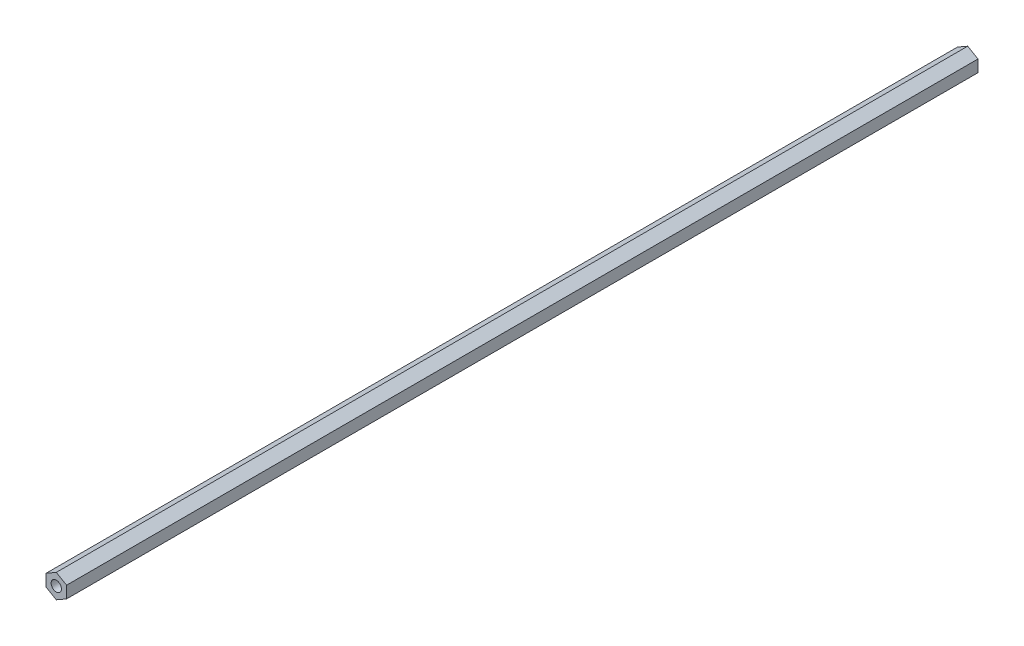
ISO-10303-21;
HEADER;
FILE_DESCRIPTION(('STEP AP214'),'2;1');
FILE_NAME('part.step','',(''),(''),'','','');
FILE_SCHEMA(('AUTOMOTIVE_DESIGN { 1 0 10303 214 1 1 1 1 }'));
ENDSEC;
DATA;
#1=APPLICATION_CONTEXT('core data for automotive mechanical design processes');
#2=APPLICATION_PROTOCOL_DEFINITION('international standard','automotive_design',2000,#1);
#3=PRODUCT_CONTEXT('',#1,'mechanical');
#4=PRODUCT('Part','Part','',(#3));
#5=PRODUCT_RELATED_PRODUCT_CATEGORY('part','',(#4));
#6=PRODUCT_DEFINITION_FORMATION('','',#4);
#7=PRODUCT_DEFINITION_CONTEXT('part definition',#1,'design');
#8=PRODUCT_DEFINITION('design','',#6,#7);
#9=PRODUCT_DEFINITION_SHAPE('','',#8);
#10=(LENGTH_UNIT() NAMED_UNIT(*) SI_UNIT(.MILLI.,.METRE.));
#11=(NAMED_UNIT(*) PLANE_ANGLE_UNIT() SI_UNIT($,.RADIAN.));
#12=(NAMED_UNIT(*) SI_UNIT($,.STERADIAN.) SOLID_ANGLE_UNIT());
#13=UNCERTAINTY_MEASURE_WITH_UNIT(LENGTH_MEASURE(1.E-05),#10,'distance_accuracy_value','');
#14=(GEOMETRIC_REPRESENTATION_CONTEXT(3) GLOBAL_UNCERTAINTY_ASSIGNED_CONTEXT((#13)) GLOBAL_UNIT_ASSIGNED_CONTEXT((#10,
#11,#12)) REPRESENTATION_CONTEXT('',''));
#15=CARTESIAN_POINT('',(0.,0.,0.));
#16=DIRECTION('',(0.,0.,1.));
#17=DIRECTION('',(1.,0.,0.));
#18=AXIS2_PLACEMENT_3D('',#15,#16,#17);
#19=CARTESIAN_POINT('',(-6.35,3.66617420935411,280.9875));
#20=DIRECTION('',(1.,0.,0.));
#21=DIRECTION('',(0.,0.,-1.));
#22=AXIS2_PLACEMENT_3D('',#19,#20,#21);
#23=PLANE('',#22);
#24=DIRECTION('',(0.,0.,-1.));
#25=VECTOR('',#24,1.);
#26=CARTESIAN_POINT('',(-6.35,3.66617420935411,280.9875));
#27=LINE('',#26,#25);
#28=CARTESIAN_POINT('',(-6.35,3.66617420935411,280.9875));
#29=VERTEX_POINT('',#28);
#30=CARTESIAN_POINT('',(-6.35,3.66617420935411,-280.9875));
#31=VERTEX_POINT('',#30);
#32=EDGE_CURVE('E141',#29,#31,#27,.T.);
#33=ORIENTED_EDGE('',*,*,#32,.T.);
#34=DIRECTION('',(0.,-1.,0.));
#35=VECTOR('',#34,1.);
#36=CARTESIAN_POINT('',(-6.35,3.66617420935411,-280.9875));
#37=LINE('',#36,#35);
#38=CARTESIAN_POINT('',(-6.35,-3.66617420935413,-280.9875));
#39=VERTEX_POINT('',#38);
#40=EDGE_CURVE('E113',#31,#39,#37,.T.);
#41=ORIENTED_EDGE('',*,*,#40,.T.);
#42=DIRECTION('',(0.,0.,-1.));
#43=VECTOR('',#42,1.);
#44=CARTESIAN_POINT('',(-6.35,-3.66617420935413,280.9875));
#45=LINE('',#44,#43);
#46=CARTESIAN_POINT('',(-6.35,-3.66617420935413,280.9875));
#47=VERTEX_POINT('',#46);
#48=EDGE_CURVE('E11',#47,#39,#45,.T.);
#49=ORIENTED_EDGE('',*,*,#48,.F.);
#50=DIRECTION('',(0.,-1.,0.));
#51=VECTOR('',#50,1.);
#52=CARTESIAN_POINT('',(-6.35,3.66617420935411,280.9875));
#53=LINE('',#52,#51);
#54=EDGE_CURVE('E131',#29,#47,#53,.T.);
#55=ORIENTED_EDGE('',*,*,#54,.F.);
#56=EDGE_LOOP('',(#33,#41,#49,#55));
#57=FACE_BOUND('',#56,.T.);
#58=ADVANCED_FACE('F37',(#57),#23,.F.);
#59=CARTESIAN_POINT('',(-6.35,-3.66617420935413,280.9875));
#60=DIRECTION('',(0.5,0.866025403784439,0.));
#61=DIRECTION('',(-0.866025403784439,0.5,0.));
#62=AXIS2_PLACEMENT_3D('',#59,#60,#61);
#63=PLANE('',#62);
#64=ORIENTED_EDGE('',*,*,#48,.T.);
#65=DIRECTION('',(0.866025403784439,-0.5,0.));
#66=VECTOR('',#65,1.);
#67=CARTESIAN_POINT('',(-6.35,-3.66617420935413,-280.9875));
#68=LINE('',#67,#66);
#69=CARTESIAN_POINT('',(0.,-7.33234841870826,-280.9875));
#70=VERTEX_POINT('',#69);
#71=EDGE_CURVE('E116',#39,#70,#68,.T.);
#72=ORIENTED_EDGE('',*,*,#71,.T.);
#73=DIRECTION('',(0.,0.,-1.));
#74=VECTOR('',#73,1.);
#75=CARTESIAN_POINT('',(0.,-7.33234841870826,280.9875));
#76=LINE('',#75,#74);
#77=CARTESIAN_POINT('',(0.,-7.33234841870826,280.9875));
#78=VERTEX_POINT('',#77);
#79=EDGE_CURVE('E44',#78,#70,#76,.T.);
#80=ORIENTED_EDGE('',*,*,#79,.F.);
#81=DIRECTION('',(0.866025403784439,-0.5,0.));
#82=VECTOR('',#81,1.);
#83=CARTESIAN_POINT('',(-6.35,-3.66617420935413,280.9875));
#84=LINE('',#83,#82);
#85=EDGE_CURVE('E133',#47,#78,#84,.T.);
#86=ORIENTED_EDGE('',*,*,#85,.F.);
#87=EDGE_LOOP('',(#64,#72,#80,#86));
#88=FACE_BOUND('',#87,.T.);
#89=ADVANCED_FACE('F161',(#88),#63,.F.);
#90=CARTESIAN_POINT('',(0.,-7.33234841870826,280.9875));
#91=DIRECTION('',(-0.5,0.866025403784439,0.));
#92=DIRECTION('',(-0.866025403784439,-0.5,0.));
#93=AXIS2_PLACEMENT_3D('',#90,#91,#92);
#94=PLANE('',#93);
#95=ORIENTED_EDGE('',*,*,#79,.T.);
#96=DIRECTION('',(0.866025403784439,0.5,0.));
#97=VECTOR('',#96,1.);
#98=CARTESIAN_POINT('',(0.,-7.33234841870826,-280.9875));
#99=LINE('',#98,#97);
#100=CARTESIAN_POINT('',(6.35,-3.66617420935414,-280.9875));
#101=VERTEX_POINT('',#100);
#102=EDGE_CURVE('E119',#70,#101,#99,.T.);
#103=ORIENTED_EDGE('',*,*,#102,.T.);
#104=DIRECTION('',(0.,0.,-1.));
#105=VECTOR('',#104,1.);
#106=CARTESIAN_POINT('',(6.35,-3.66617420935414,280.9875));
#107=LINE('',#106,#105);
#108=CARTESIAN_POINT('',(6.35,-3.66617420935414,280.9875));
#109=VERTEX_POINT('',#108);
#110=EDGE_CURVE('E147',#109,#101,#107,.T.);
#111=ORIENTED_EDGE('',*,*,#110,.F.);
#112=DIRECTION('',(0.866025403784439,0.5,0.));
#113=VECTOR('',#112,1.);
#114=CARTESIAN_POINT('',(0.,-7.33234841870826,280.9875));
#115=LINE('',#114,#113);
#116=EDGE_CURVE('E135',#78,#109,#115,.T.);
#117=ORIENTED_EDGE('',*,*,#116,.F.);
#118=EDGE_LOOP('',(#95,#103,#111,#117));
#119=FACE_BOUND('',#118,.T.);
#120=ADVANCED_FACE('F152',(#119),#94,.F.);
#121=CARTESIAN_POINT('',(6.35,-3.66617420935414,280.9875));
#122=DIRECTION('',(-1.,0.,0.));
#123=DIRECTION('',(0.,-1.,0.));
#124=AXIS2_PLACEMENT_3D('',#121,#122,#123);
#125=PLANE('',#124);
#126=ORIENTED_EDGE('',*,*,#110,.T.);
#127=DIRECTION('',(0.,1.,0.));
#128=VECTOR('',#127,1.);
#129=CARTESIAN_POINT('',(6.35,-3.66617420935414,-280.9875));
#130=LINE('',#129,#128);
#131=CARTESIAN_POINT('',(6.35,3.66617420935412,-280.9875));
#132=VERTEX_POINT('',#131);
#133=EDGE_CURVE('E122',#101,#132,#130,.T.);
#134=ORIENTED_EDGE('',*,*,#133,.T.);
#135=DIRECTION('',(0.,0.,-1.));
#136=VECTOR('',#135,1.);
#137=CARTESIAN_POINT('',(6.35,3.66617420935412,280.9875));
#138=LINE('',#137,#136);
#139=CARTESIAN_POINT('',(6.35,3.66617420935412,280.9875));
#140=VERTEX_POINT('',#139);
#141=EDGE_CURVE('E145',#140,#132,#138,.T.);
#142=ORIENTED_EDGE('',*,*,#141,.F.);
#143=DIRECTION('',(0.,1.,0.));
#144=VECTOR('',#143,1.);
#145=CARTESIAN_POINT('',(6.35,-3.66617420935414,280.9875));
#146=LINE('',#145,#144);
#147=EDGE_CURVE('E137',#109,#140,#146,.T.);
#148=ORIENTED_EDGE('',*,*,#147,.F.);
#149=EDGE_LOOP('',(#126,#134,#142,#148));
#150=FACE_BOUND('',#149,.T.);
#151=ADVANCED_FACE('F172',(#150),#125,.F.);
#152=CARTESIAN_POINT('',(6.35,3.66617420935412,280.9875));
#153=DIRECTION('',(-0.5,-0.866025403784438,0.));
#154=DIRECTION('',(0.866025403784439,-0.5,0.));
#155=AXIS2_PLACEMENT_3D('',#152,#153,#154);
#156=PLANE('',#155);
#157=ORIENTED_EDGE('',*,*,#141,.T.);
#158=DIRECTION('',(-0.866025403784439,0.5,0.));
#159=VECTOR('',#158,1.);
#160=CARTESIAN_POINT('',(6.35,3.66617420935412,-280.9875));
#161=LINE('',#160,#159);
#162=CARTESIAN_POINT('',(0.,7.33234841870824,-280.9875));
#163=VERTEX_POINT('',#162);
#164=EDGE_CURVE('E125',#132,#163,#161,.T.);
#165=ORIENTED_EDGE('',*,*,#164,.T.);
#166=DIRECTION('',(0.,0.,-1.));
#167=VECTOR('',#166,1.);
#168=CARTESIAN_POINT('',(0.,7.33234841870824,280.9875));
#169=LINE('',#168,#167);
#170=CARTESIAN_POINT('',(0.,7.33234841870824,280.9875));
#171=VERTEX_POINT('',#170);
#172=EDGE_CURVE('E143',#171,#163,#169,.T.);
#173=ORIENTED_EDGE('',*,*,#172,.F.);
#174=DIRECTION('',(-0.866025403784439,0.5,0.));
#175=VECTOR('',#174,1.);
#176=CARTESIAN_POINT('',(6.35,3.66617420935412,280.9875));
#177=LINE('',#176,#175);
#178=EDGE_CURVE('E56',#140,#171,#177,.T.);
#179=ORIENTED_EDGE('',*,*,#178,.F.);
#180=EDGE_LOOP('',(#157,#165,#173,#179));
#181=FACE_BOUND('',#180,.T.);
#182=ADVANCED_FACE('F169',(#181),#156,.F.);
#183=CARTESIAN_POINT('',(0.,7.33234841870824,280.9875));
#184=DIRECTION('',(0.5,-0.866025403784439,0.));
#185=DIRECTION('',(0.866025403784439,0.5,0.));
#186=AXIS2_PLACEMENT_3D('',#183,#184,#185);
#187=PLANE('',#186);
#188=ORIENTED_EDGE('',*,*,#172,.T.);
#189=DIRECTION('',(-0.866025403784439,-0.5,0.));
#190=VECTOR('',#189,1.);
#191=CARTESIAN_POINT('',(0.,7.33234841870824,-280.9875));
#192=LINE('',#191,#190);
#193=EDGE_CURVE('E128',#163,#31,#192,.T.);
#194=ORIENTED_EDGE('',*,*,#193,.T.);
#195=ORIENTED_EDGE('',*,*,#32,.F.);
#196=DIRECTION('',(-0.866025403784439,-0.5,0.));
#197=VECTOR('',#196,1.);
#198=CARTESIAN_POINT('',(0.,7.33234841870824,280.9875));
#199=LINE('',#198,#197);
#200=EDGE_CURVE('E51',#171,#29,#199,.T.);
#201=ORIENTED_EDGE('',*,*,#200,.F.);
#202=EDGE_LOOP('',(#188,#194,#195,#201));
#203=FACE_BOUND('',#202,.T.);
#204=ADVANCED_FACE('F167',(#203),#187,.F.);
#205=CARTESIAN_POINT('',(0.,0.,280.9875));
#206=DIRECTION('',(0.,0.,1.));
#207=DIRECTION('',(1.,0.,0.));
#208=AXIS2_PLACEMENT_3D('',#205,#206,#207);
#209=PLANE('',#208);
#210=CARTESIAN_POINT('',(0.,0.,280.9875));
#211=DIRECTION('',(0.,0.,1.));
#212=DIRECTION('',(1.,0.,0.));
#213=AXIS2_PLACEMENT_3D('',#210,#211,#212);
#214=CIRCLE('',#213,3.17499999999999);
#215=CARTESIAN_POINT('',(3.17499999999999,0.,280.9875));
#216=VERTEX_POINT('',#215);
#217=EDGE_CURVE('E102',#216,#216,#214,.T.);
#218=ORIENTED_EDGE('',*,*,#217,.F.);
#219=EDGE_LOOP('',(#218));
#220=FACE_BOUND('',#219,.T.);
#221=ORIENTED_EDGE('',*,*,#54,.T.);
#222=ORIENTED_EDGE('',*,*,#85,.T.);
#223=ORIENTED_EDGE('',*,*,#116,.T.);
#224=ORIENTED_EDGE('',*,*,#147,.T.);
#225=ORIENTED_EDGE('',*,*,#178,.T.);
#226=ORIENTED_EDGE('',*,*,#200,.T.);
#227=EDGE_LOOP('',(#221,#222,#223,#224,#225,#226));
#228=FACE_BOUND('',#227,.T.);
#229=ADVANCED_FACE('F174',(#220,#228),#209,.T.);
#230=CARTESIAN_POINT('',(0.,0.,-280.9875));
#231=DIRECTION('',(0.,0.,1.));
#232=DIRECTION('',(1.,0.,0.));
#233=AXIS2_PLACEMENT_3D('',#230,#231,#232);
#234=PLANE('',#233);
#235=CARTESIAN_POINT('',(0.,0.,-280.9875));
#236=DIRECTION('',(0.,0.,-1.));
#237=DIRECTION('',(-1.,0.,0.));
#238=AXIS2_PLACEMENT_3D('',#235,#236,#237);
#239=CIRCLE('',#238,3.17499999999999);
#240=CARTESIAN_POINT('',(-3.17499999999999,0.,-280.9875));
#241=VERTEX_POINT('',#240);
#242=EDGE_CURVE('E103',#241,#241,#239,.T.);
#243=ORIENTED_EDGE('',*,*,#242,.F.);
#244=EDGE_LOOP('',(#243));
#245=FACE_BOUND('',#244,.T.);
#246=ORIENTED_EDGE('',*,*,#40,.F.);
#247=ORIENTED_EDGE('',*,*,#193,.F.);
#248=ORIENTED_EDGE('',*,*,#164,.F.);
#249=ORIENTED_EDGE('',*,*,#133,.F.);
#250=ORIENTED_EDGE('',*,*,#102,.F.);
#251=ORIENTED_EDGE('',*,*,#71,.F.);
#252=EDGE_LOOP('',(#246,#247,#248,#249,#250,#251));
#253=FACE_BOUND('',#252,.T.);
#254=ADVANCED_FACE('F159',(#245,#253),#234,.F.);
#255=CARTESIAN_POINT('',(0.,0.,255.5875));
#256=DIRECTION('',(0.,0.,1.));
#257=DIRECTION('',(1.,0.,0.));
#258=AXIS2_PLACEMENT_3D('',#255,#256,#257);
#259=CONICAL_SURFACE('',#258,3.17499999999995,1.02974425867665);
#260=CARTESIAN_POINT('',(0.,0.,253.679767534588));
#261=VERTEX_POINT('',#260);
#262=VERTEX_LOOP('',#261);
#263=FACE_BOUND('',#262,.T.);
#264=CARTESIAN_POINT('',(0.,0.,255.5875));
#265=DIRECTION('',(0.,0.,1.));
#266=DIRECTION('',(1.,0.,0.));
#267=AXIS2_PLACEMENT_3D('',#264,#265,#266);
#268=CIRCLE('',#267,3.17499999999995);
#269=CARTESIAN_POINT('',(3.17499999999995,0.,255.5875));
#270=VERTEX_POINT('',#269);
#271=EDGE_CURVE('E106',#270,#270,#268,.T.);
#272=ORIENTED_EDGE('',*,*,#271,.T.);
#273=EDGE_LOOP('',(#272));
#274=FACE_BOUND('',#273,.T.);
#275=ADVANCED_FACE('F182',(#263,#274),#259,.F.);
#276=CARTESIAN_POINT('',(0.,0.,280.9875));
#277=DIRECTION('',(0.,0.,1.));
#278=DIRECTION('',(1.,0.,0.));
#279=AXIS2_PLACEMENT_3D('',#276,#277,#278);
#280=CYLINDRICAL_SURFACE('',#279,3.17499999999997);
#281=ORIENTED_EDGE('',*,*,#271,.F.);
#282=EDGE_LOOP('',(#281));
#283=FACE_BOUND('',#282,.T.);
#284=ORIENTED_EDGE('',*,*,#217,.T.);
#285=EDGE_LOOP('',(#284));
#286=FACE_BOUND('',#285,.T.);
#287=ADVANCED_FACE('F96',(#283,#286),#280,.F.);
#288=CARTESIAN_POINT('',(0.,0.,-255.5875));
#289=DIRECTION('',(0.,0.,-1.));
#290=DIRECTION('',(-1.,0.,0.));
#291=AXIS2_PLACEMENT_3D('',#288,#289,#290);
#292=CONICAL_SURFACE('',#291,3.17499999999995,1.02974425867665);
#293=CARTESIAN_POINT('',(0.,0.,-253.679767534588));
#294=VERTEX_POINT('',#293);
#295=VERTEX_LOOP('',#294);
#296=FACE_BOUND('',#295,.T.);
#297=CARTESIAN_POINT('',(0.,0.,-255.5875));
#298=DIRECTION('',(0.,0.,-1.));
#299=DIRECTION('',(-1.,0.,0.));
#300=AXIS2_PLACEMENT_3D('',#297,#298,#299);
#301=CIRCLE('',#300,3.17499999999995);
#302=CARTESIAN_POINT('',(-3.17499999999995,0.,-255.5875));
#303=VERTEX_POINT('',#302);
#304=EDGE_CURVE('E100',#303,#303,#301,.T.);
#305=ORIENTED_EDGE('',*,*,#304,.T.);
#306=EDGE_LOOP('',(#305));
#307=FACE_BOUND('',#306,.T.);
#308=ADVANCED_FACE('F92',(#296,#307),#292,.F.);
#309=CARTESIAN_POINT('',(0.,0.,-280.9875));
#310=DIRECTION('',(0.,0.,-1.));
#311=DIRECTION('',(-1.,0.,0.));
#312=AXIS2_PLACEMENT_3D('',#309,#310,#311);
#313=CYLINDRICAL_SURFACE('',#312,3.17499999999997);
#314=ORIENTED_EDGE('',*,*,#304,.F.);
#315=EDGE_LOOP('',(#314));
#316=FACE_BOUND('',#315,.T.);
#317=ORIENTED_EDGE('',*,*,#242,.T.);
#318=EDGE_LOOP('',(#317));
#319=FACE_BOUND('',#318,.T.);
#320=ADVANCED_FACE('F95',(#316,#319),#313,.F.);
#321=CLOSED_SHELL('',(#58,#89,#120,#151,#182,#204,#229,#254,#275,#287,#308,#320));
#322=MANIFOLD_SOLID_BREP('B2',#321);
#323=ADVANCED_BREP_SHAPE_REPRESENTATION('',(#18,#322),#14);
#324=SHAPE_DEFINITION_REPRESENTATION(#9,#323);
ENDSEC;
END-ISO-10303-21;
